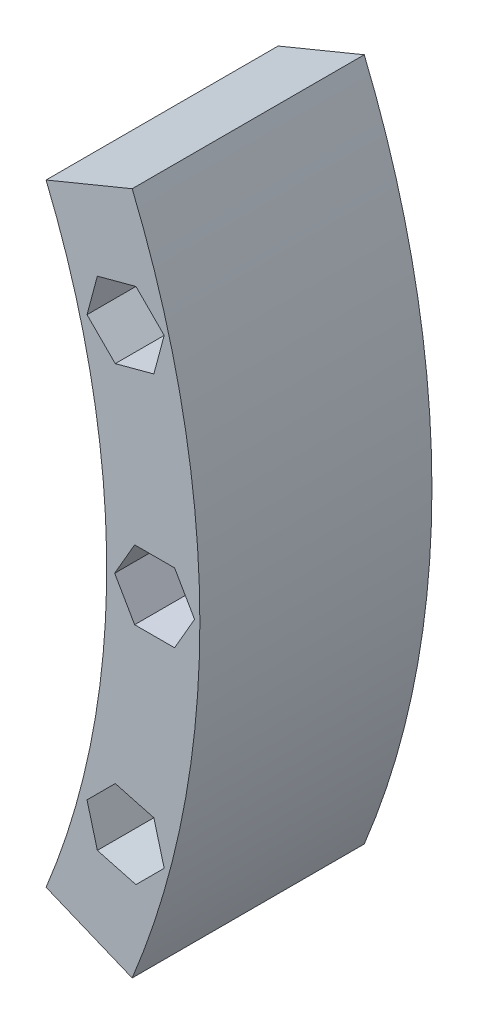
ISO-10303-21;
HEADER;
FILE_DESCRIPTION(('STEP AP214'),'2;1');
FILE_NAME('part.step','',(''),(''),'','','');
FILE_SCHEMA(('AUTOMOTIVE_DESIGN { 1 0 10303 214 1 1 1 1 }'));
ENDSEC;
DATA;
#1=APPLICATION_CONTEXT('core data for automotive mechanical design processes');
#2=APPLICATION_PROTOCOL_DEFINITION('international standard','automotive_design',2000,#1);
#3=PRODUCT_CONTEXT('',#1,'mechanical');
#4=PRODUCT('Part','Part','',(#3));
#5=PRODUCT_RELATED_PRODUCT_CATEGORY('part','',(#4));
#6=PRODUCT_DEFINITION_FORMATION('','',#4);
#7=PRODUCT_DEFINITION_CONTEXT('part definition',#1,'design');
#8=PRODUCT_DEFINITION('design','',#6,#7);
#9=PRODUCT_DEFINITION_SHAPE('','',#8);
#10=(LENGTH_UNIT() NAMED_UNIT(*) SI_UNIT(.MILLI.,.METRE.));
#11=(NAMED_UNIT(*) PLANE_ANGLE_UNIT() SI_UNIT($,.RADIAN.));
#12=(NAMED_UNIT(*) SI_UNIT($,.STERADIAN.) SOLID_ANGLE_UNIT());
#13=UNCERTAINTY_MEASURE_WITH_UNIT(LENGTH_MEASURE(1.E-05),#10,'distance_accuracy_value','');
#14=(GEOMETRIC_REPRESENTATION_CONTEXT(3) GLOBAL_UNCERTAINTY_ASSIGNED_CONTEXT((#13)) GLOBAL_UNIT_ASSIGNED_CONTEXT((#10,
#11,#12)) REPRESENTATION_CONTEXT('',''));
#15=CARTESIAN_POINT('',(0.,0.,0.));
#16=DIRECTION('',(0.,0.,1.));
#17=DIRECTION('',(1.,0.,0.));
#18=AXIS2_PLACEMENT_3D('',#15,#16,#17);
#19=CARTESIAN_POINT('',(0.,0.,21.81));
#20=DIRECTION('',(0.,0.,-1.));
#21=DIRECTION('',(-1.,0.,0.));
#22=AXIS2_PLACEMENT_3D('',#19,#20,#21);
#23=PLANE('',#22);
#24=DIRECTION('',(0.258819045102525,0.965925826289067,0.));
#25=VECTOR('',#24,1.);
#26=CARTESIAN_POINT('',(80.8989700859897,21.6768137030501,21.81));
#27=LINE('',#26,#25);
#28=CARTESIAN_POINT('',(79.9276799911408,18.0519097201859,21.81));
#29=VERTEX_POINT('',#28);
#30=CARTESIAN_POINT('',(80.8989700859897,21.6768137030501,21.81));
#31=VERTEX_POINT('',#30);
#32=EDGE_CURVE('E233',#29,#31,#27,.T.);
#33=ORIENTED_EDGE('',*,*,#32,.F.);
#34=DIRECTION('',(0.96592582628907,0.258819045102514,0.));
#35=VECTOR('',#34,1.);
#36=CARTESIAN_POINT('',(79.9276799911408,18.0519097201859,21.81));
#37=LINE('',#36,#35);
#38=CARTESIAN_POINT('',(76.3027760082773,17.0806196253373,21.81));
#39=VERTEX_POINT('',#38);
#40=EDGE_CURVE('E245',#39,#29,#37,.T.);
#41=ORIENTED_EDGE('',*,*,#40,.F.);
#42=DIRECTION('',(0.707106781186542,-0.707106781186553,0.));
#43=VECTOR('',#42,1.);
#44=CARTESIAN_POINT('',(76.3027760082773,17.0806196253373,21.81));
#45=LINE('',#44,#43);
#46=CARTESIAN_POINT('',(73.649162120262,19.7342335133527,21.81));
#47=VERTEX_POINT('',#46);
#48=EDGE_CURVE('E242',#47,#39,#45,.T.);
#49=ORIENTED_EDGE('',*,*,#48,.F.);
#50=DIRECTION('',(-0.258819045102526,-0.965925826289067,0.));
#51=VECTOR('',#50,1.);
#52=CARTESIAN_POINT('',(73.649162120262,19.7342335133527,21.81));
#53=LINE('',#52,#51);
#54=CARTESIAN_POINT('',(74.6204522151106,23.3591374962161,21.81));
#55=VERTEX_POINT('',#54);
#56=EDGE_CURVE('E240',#55,#47,#53,.T.);
#57=ORIENTED_EDGE('',*,*,#56,.F.);
#58=DIRECTION('',(-0.96592582628907,-0.258819045102513,0.));
#59=VECTOR('',#58,1.);
#60=CARTESIAN_POINT('',(74.6204522151106,23.3591374962161,21.81));
#61=LINE('',#60,#59);
#62=CARTESIAN_POINT('',(78.2453561979748,24.3304275910649,21.81));
#63=VERTEX_POINT('',#62);
#64=EDGE_CURVE('E238',#63,#55,#61,.T.);
#65=ORIENTED_EDGE('',*,*,#64,.F.);
#66=DIRECTION('',(-0.707106781186541,0.707106781186554,0.));
#67=VECTOR('',#66,1.);
#68=CARTESIAN_POINT('',(78.2453561979748,24.3304275910649,21.81));
#69=LINE('',#68,#67);
#70=EDGE_CURVE('E235',#31,#63,#69,.T.);
#71=ORIENTED_EDGE('',*,*,#70,.F.);
#72=EDGE_LOOP('',(#33,#41,#49,#57,#65,#71));
#73=FACE_BOUND('',#72,.T.);
#74=DIRECTION('',(-0.924546033612337,-0.381070376350217,0.));
#75=VECTOR('',#74,1.);
#76=CARTESIAN_POINT('',(77.1995938066281,31.8193764252479,21.81));
#77=LINE('',#76,#75);
#78=CARTESIAN_POINT('',(77.8930033318373,32.1051792075106,21.81));
#79=VERTEX_POINT('',#78);
#80=CARTESIAN_POINT('',(69.8032255377296,28.7708134144457,21.81));
#81=VERTEX_POINT('',#80);
#82=EDGE_CURVE('E323',#79,#81,#77,.T.);
#83=ORIENTED_EDGE('',*,*,#82,.T.);
#84=CARTESIAN_POINT('',(0.,0.,21.81));
#85=DIRECTION('',(0.,0.,-1.));
#86=DIRECTION('',(-1.,0.,0.));
#87=AXIS2_PLACEMENT_3D('',#84,#85,#86);
#88=CIRCLE('',#87,75.5);
#89=CARTESIAN_POINT('',(69.8032255377296,-28.7708134144457,21.81));
#90=VERTEX_POINT('',#89);
#91=EDGE_CURVE('E325',#81,#90,#88,.T.);
#92=ORIENTED_EDGE('',*,*,#91,.T.);
#93=DIRECTION('',(0.924546033612313,-0.381070376350275,0.));
#94=VECTOR('',#93,1.);
#95=CARTESIAN_POINT('',(77.1995938066281,-31.8193764252479,21.81));
#96=LINE('',#95,#94);
#97=CARTESIAN_POINT('',(77.8930033318373,-32.1051792075106,21.81));
#98=VERTEX_POINT('',#97);
#99=EDGE_CURVE('E328',#90,#98,#96,.T.);
#100=ORIENTED_EDGE('',*,*,#99,.T.);
#101=CARTESIAN_POINT('',(0.,0.,21.81));
#102=DIRECTION('',(0.,0.,1.));
#103=DIRECTION('',(-1.,0.,0.));
#104=AXIS2_PLACEMENT_3D('',#101,#102,#103);
#105=CIRCLE('',#104,84.2499999999999);
#106=EDGE_CURVE('E330',#98,#79,#105,.T.);
#107=ORIENTED_EDGE('',*,*,#106,.T.);
#108=EDGE_LOOP('',(#83,#92,#100,#107));
#109=FACE_BOUND('',#108,.T.);
#110=DIRECTION('',(-0.5,-0.866025403784438,0.));
#111=VECTOR('',#110,1.);
#112=CARTESIAN_POINT('',(78.1236116251337,3.25000000000181,21.81));
#113=LINE('',#112,#111);
#114=CARTESIAN_POINT('',(78.1236116251337,3.25000000000181,21.81));
#115=VERTEX_POINT('',#114);
#116=CARTESIAN_POINT('',(76.2472232502674,1.81723126130295E-12,21.81));
#117=VERTEX_POINT('',#116);
#118=EDGE_CURVE('E278',#115,#117,#113,.T.);
#119=ORIENTED_EDGE('',*,*,#118,.F.);
#120=DIRECTION('',(-1.,0.,0.));
#121=VECTOR('',#120,1.);
#122=CARTESIAN_POINT('',(81.8763883748663,3.25000000000181,21.81));
#123=LINE('',#122,#121);
#124=CARTESIAN_POINT('',(81.8763883748663,3.25000000000181,21.81));
#125=VERTEX_POINT('',#124);
#126=EDGE_CURVE('E290',#125,#115,#123,.T.);
#127=ORIENTED_EDGE('',*,*,#126,.F.);
#128=DIRECTION('',(-0.5,0.866025403784439,0.));
#129=VECTOR('',#128,1.);
#130=CARTESIAN_POINT('',(83.7527767497325,1.81164762011465E-12,21.81));
#131=LINE('',#130,#129);
#132=CARTESIAN_POINT('',(83.7527767497325,1.81164762011465E-12,21.81));
#133=VERTEX_POINT('',#132);
#134=EDGE_CURVE('E287',#133,#125,#131,.T.);
#135=ORIENTED_EDGE('',*,*,#134,.F.);
#136=DIRECTION('',(0.5,0.866025403784439,0.));
#137=VECTOR('',#136,1.);
#138=CARTESIAN_POINT('',(81.8763883748663,-3.24999999999819,21.81));
#139=LINE('',#138,#137);
#140=CARTESIAN_POINT('',(81.8763883748663,-3.24999999999819,21.81));
#141=VERTEX_POINT('',#140);
#142=EDGE_CURVE('E285',#141,#133,#139,.T.);
#143=ORIENTED_EDGE('',*,*,#142,.F.);
#144=DIRECTION('',(1.,0.,0.));
#145=VECTOR('',#144,1.);
#146=CARTESIAN_POINT('',(78.1236116251337,-3.24999999999819,21.81));
#147=LINE('',#146,#145);
#148=CARTESIAN_POINT('',(78.1236116251337,-3.24999999999819,21.81));
#149=VERTEX_POINT('',#148);
#150=EDGE_CURVE('E283',#149,#141,#147,.T.);
#151=ORIENTED_EDGE('',*,*,#150,.F.);
#152=DIRECTION('',(0.5,-0.866025403784439,0.));
#153=VECTOR('',#152,1.);
#154=CARTESIAN_POINT('',(76.2472232502674,1.81723126130295E-12,21.81));
#155=LINE('',#154,#153);
#156=EDGE_CURVE('E280',#117,#149,#155,.T.);
#157=ORIENTED_EDGE('',*,*,#156,.F.);
#158=EDGE_LOOP('',(#119,#127,#135,#143,#151,#157));
#159=FACE_BOUND('',#158,.T.);
#160=DIRECTION('',(0.258819045102525,-0.965925826289067,0.));
#161=VECTOR('',#160,1.);
#162=CARTESIAN_POINT('',(73.649162120262,-19.7342335133526,21.81));
#163=LINE('',#162,#161);
#164=CARTESIAN_POINT('',(73.649162120262,-19.7342335133526,21.81));
#165=VERTEX_POINT('',#164);
#166=CARTESIAN_POINT('',(74.6204522151107,-23.3591374962161,21.81));
#167=VERTEX_POINT('',#166);
#168=EDGE_CURVE('E182',#165,#167,#163,.T.);
#169=ORIENTED_EDGE('',*,*,#168,.F.);
#170=DIRECTION('',(-0.707106781186542,-0.707106781186553,0.));
#171=VECTOR('',#170,1.);
#172=CARTESIAN_POINT('',(76.3027760082767,-17.0806196253379,21.81));
#173=LINE('',#172,#171);
#174=CARTESIAN_POINT('',(76.3027760082767,-17.0806196253379,21.81));
#175=VERTEX_POINT('',#174);
#176=EDGE_CURVE('E211',#175,#165,#173,.T.);
#177=ORIENTED_EDGE('',*,*,#176,.F.);
#178=DIRECTION('',(-0.96592582628907,0.258819045102514,0.));
#179=VECTOR('',#178,1.);
#180=CARTESIAN_POINT('',(79.9276799911411,-18.0519097201868,21.81));
#181=LINE('',#180,#179);
#182=CARTESIAN_POINT('',(79.9276799911411,-18.0519097201868,21.81));
#183=VERTEX_POINT('',#182);
#184=EDGE_CURVE('E209',#183,#175,#181,.T.);
#185=ORIENTED_EDGE('',*,*,#184,.F.);
#186=DIRECTION('',(-0.258819045102528,0.965925826289066,0.));
#187=VECTOR('',#186,1.);
#188=CARTESIAN_POINT('',(80.8989700859897,-21.67681370305,21.81));
#189=LINE('',#188,#187);
#190=CARTESIAN_POINT('',(80.8989700859897,-21.67681370305,21.81));
#191=VERTEX_POINT('',#190);
#192=EDGE_CURVE('E205',#191,#183,#189,.T.);
#193=ORIENTED_EDGE('',*,*,#192,.F.);
#194=DIRECTION('',(0.707106781186545,0.70710678118655,0.));
#195=VECTOR('',#194,1.);
#196=CARTESIAN_POINT('',(78.2453561979748,-24.3304275910649,21.81));
#197=LINE('',#196,#195);
#198=CARTESIAN_POINT('',(78.2453561979748,-24.3304275910649,21.81));
#199=VERTEX_POINT('',#198);
#200=EDGE_CURVE('E203',#199,#191,#197,.T.);
#201=ORIENTED_EDGE('',*,*,#200,.F.);
#202=DIRECTION('',(0.96592582628907,-0.258819045102513,0.));
#203=VECTOR('',#202,1.);
#204=CARTESIAN_POINT('',(74.6204522151107,-23.3591374962161,21.81));
#205=LINE('',#204,#203);
#206=EDGE_CURVE('E190',#167,#199,#205,.T.);
#207=ORIENTED_EDGE('',*,*,#206,.F.);
#208=EDGE_LOOP('',(#169,#177,#185,#193,#201,#207));
#209=FACE_BOUND('',#208,.T.);
#210=ADVANCED_FACE('F33',(#73,#109,#159,#209),#23,.F.);
#211=CARTESIAN_POINT('',(0.,0.,0.01));
#212=DIRECTION('',(0.,0.,-1.));
#213=DIRECTION('',(-1.,0.,0.));
#214=AXIS2_PLACEMENT_3D('',#211,#212,#213);
#215=PLANE('',#214);
#216=DIRECTION('',(-0.924546033612311,-0.38107037635028,0.));
#217=VECTOR('',#216,1.);
#218=CARTESIAN_POINT('',(77.1995938066281,31.8193764252479,0.01));
#219=LINE('',#218,#217);
#220=CARTESIAN_POINT('',(77.8930033318373,32.1051792075106,0.01));
#221=VERTEX_POINT('',#220);
#222=CARTESIAN_POINT('',(69.8032255377296,28.7708134144457,0.01));
#223=VERTEX_POINT('',#222);
#224=EDGE_CURVE('E322',#221,#223,#219,.T.);
#225=ORIENTED_EDGE('',*,*,#224,.F.);
#226=CARTESIAN_POINT('',(0.,0.,0.01));
#227=DIRECTION('',(0.,0.,1.));
#228=DIRECTION('',(-1.,0.,0.));
#229=AXIS2_PLACEMENT_3D('',#226,#227,#228);
#230=CIRCLE('',#229,84.2499999999999);
#231=CARTESIAN_POINT('',(77.8930033318373,-32.1051792075106,0.01));
#232=VERTEX_POINT('',#231);
#233=EDGE_CURVE('E326',#232,#221,#230,.T.);
#234=ORIENTED_EDGE('',*,*,#233,.F.);
#235=DIRECTION('',(0.924546033612314,-0.381070376350271,0.));
#236=VECTOR('',#235,1.);
#237=CARTESIAN_POINT('',(77.1995938066281,-31.8193764252479,0.01));
#238=LINE('',#237,#236);
#239=CARTESIAN_POINT('',(69.8032255377296,-28.7708134144457,0.01));
#240=VERTEX_POINT('',#239);
#241=EDGE_CURVE('E337',#240,#232,#238,.T.);
#242=ORIENTED_EDGE('',*,*,#241,.F.);
#243=CARTESIAN_POINT('',(0.,0.,0.01));
#244=DIRECTION('',(0.,0.,-1.));
#245=DIRECTION('',(-1.,0.,0.));
#246=AXIS2_PLACEMENT_3D('',#243,#244,#245);
#247=CIRCLE('',#246,75.5);
#248=EDGE_CURVE('E334',#223,#240,#247,.T.);
#249=ORIENTED_EDGE('',*,*,#248,.F.);
#250=EDGE_LOOP('',(#225,#234,#242,#249));
#251=FACE_BOUND('',#250,.T.);
#252=DIRECTION('',(-1.,0.,0.));
#253=VECTOR('',#252,1.);
#254=CARTESIAN_POINT('',(81.8763883748663,3.25000000000181,0.01));
#255=LINE('',#254,#253);
#256=CARTESIAN_POINT('',(81.8763883748663,3.25000000000181,0.01));
#257=VERTEX_POINT('',#256);
#258=CARTESIAN_POINT('',(78.1236116251337,3.25000000000181,0.01));
#259=VERTEX_POINT('',#258);
#260=EDGE_CURVE('E281',#257,#259,#255,.T.);
#261=ORIENTED_EDGE('',*,*,#260,.T.);
#262=DIRECTION('',(-0.5,-0.866025403784438,0.));
#263=VECTOR('',#262,1.);
#264=CARTESIAN_POINT('',(78.1236116251337,3.25000000000181,0.01));
#265=LINE('',#264,#263);
#266=CARTESIAN_POINT('',(76.2472232502674,1.81723126130295E-12,0.01));
#267=VERTEX_POINT('',#266);
#268=EDGE_CURVE('E277',#259,#267,#265,.T.);
#269=ORIENTED_EDGE('',*,*,#268,.T.);
#270=DIRECTION('',(0.5,-0.866025403784439,0.));
#271=VECTOR('',#270,1.);
#272=CARTESIAN_POINT('',(76.2472232502674,1.81723126130295E-12,0.01));
#273=LINE('',#272,#271);
#274=CARTESIAN_POINT('',(78.1236116251337,-3.24999999999819,0.01));
#275=VERTEX_POINT('',#274);
#276=EDGE_CURVE('E295',#267,#275,#273,.T.);
#277=ORIENTED_EDGE('',*,*,#276,.T.);
#278=DIRECTION('',(1.,0.,0.));
#279=VECTOR('',#278,1.);
#280=CARTESIAN_POINT('',(78.1236116251337,-3.24999999999819,0.01));
#281=LINE('',#280,#279);
#282=CARTESIAN_POINT('',(81.8763883748663,-3.24999999999819,0.01));
#283=VERTEX_POINT('',#282);
#284=EDGE_CURVE('E298',#275,#283,#281,.T.);
#285=ORIENTED_EDGE('',*,*,#284,.T.);
#286=DIRECTION('',(0.5,0.866025403784439,0.));
#287=VECTOR('',#286,1.);
#288=CARTESIAN_POINT('',(81.8763883748663,-3.24999999999819,0.01));
#289=LINE('',#288,#287);
#290=CARTESIAN_POINT('',(83.7527767497325,1.81164762011465E-12,0.01));
#291=VERTEX_POINT('',#290);
#292=EDGE_CURVE('E301',#283,#291,#289,.T.);
#293=ORIENTED_EDGE('',*,*,#292,.T.);
#294=DIRECTION('',(-0.5,0.866025403784439,0.));
#295=VECTOR('',#294,1.);
#296=CARTESIAN_POINT('',(83.7527767497325,1.81164762011465E-12,0.01));
#297=LINE('',#296,#295);
#298=EDGE_CURVE('E304',#291,#257,#297,.T.);
#299=ORIENTED_EDGE('',*,*,#298,.T.);
#300=EDGE_LOOP('',(#261,#269,#277,#285,#293,#299));
#301=FACE_BOUND('',#300,.T.);
#302=DIRECTION('',(0.96592582628907,0.258819045102514,0.));
#303=VECTOR('',#302,1.);
#304=CARTESIAN_POINT('',(79.9276799911408,18.0519097201859,0.01));
#305=LINE('',#304,#303);
#306=CARTESIAN_POINT('',(76.3027760082773,17.0806196253373,0.01));
#307=VERTEX_POINT('',#306);
#308=CARTESIAN_POINT('',(79.9276799911408,18.0519097201859,0.01));
#309=VERTEX_POINT('',#308);
#310=EDGE_CURVE('E236',#307,#309,#305,.T.);
#311=ORIENTED_EDGE('',*,*,#310,.T.);
#312=DIRECTION('',(0.258819045102525,0.965925826289067,0.));
#313=VECTOR('',#312,1.);
#314=CARTESIAN_POINT('',(80.8989700859897,21.6768137030501,0.01));
#315=LINE('',#314,#313);
#316=CARTESIAN_POINT('',(80.8989700859897,21.6768137030501,0.01));
#317=VERTEX_POINT('',#316);
#318=EDGE_CURVE('E198',#309,#317,#315,.T.);
#319=ORIENTED_EDGE('',*,*,#318,.T.);
#320=DIRECTION('',(-0.707106781186541,0.707106781186554,0.));
#321=VECTOR('',#320,1.);
#322=CARTESIAN_POINT('',(78.2453561979748,24.3304275910649,0.01));
#323=LINE('',#322,#321);
#324=CARTESIAN_POINT('',(78.2453561979748,24.3304275910649,0.01));
#325=VERTEX_POINT('',#324);
#326=EDGE_CURVE('E250',#317,#325,#323,.T.);
#327=ORIENTED_EDGE('',*,*,#326,.T.);
#328=DIRECTION('',(-0.96592582628907,-0.258819045102513,0.));
#329=VECTOR('',#328,1.);
#330=CARTESIAN_POINT('',(74.6204522151106,23.3591374962161,0.01));
#331=LINE('',#330,#329);
#332=CARTESIAN_POINT('',(74.6204522151106,23.3591374962161,0.01));
#333=VERTEX_POINT('',#332);
#334=EDGE_CURVE('E253',#325,#333,#331,.T.);
#335=ORIENTED_EDGE('',*,*,#334,.T.);
#336=DIRECTION('',(-0.258819045102526,-0.965925826289067,0.));
#337=VECTOR('',#336,1.);
#338=CARTESIAN_POINT('',(73.649162120262,19.7342335133527,0.01));
#339=LINE('',#338,#337);
#340=CARTESIAN_POINT('',(73.649162120262,19.7342335133527,0.01));
#341=VERTEX_POINT('',#340);
#342=EDGE_CURVE('E256',#333,#341,#339,.T.);
#343=ORIENTED_EDGE('',*,*,#342,.T.);
#344=DIRECTION('',(0.707106781186542,-0.707106781186553,0.));
#345=VECTOR('',#344,1.);
#346=CARTESIAN_POINT('',(76.3027760082773,17.0806196253373,0.01));
#347=LINE('',#346,#345);
#348=EDGE_CURVE('E259',#341,#307,#347,.T.);
#349=ORIENTED_EDGE('',*,*,#348,.T.);
#350=EDGE_LOOP('',(#311,#319,#327,#335,#343,#349));
#351=FACE_BOUND('',#350,.T.);
#352=DIRECTION('',(-0.707106781186542,-0.707106781186553,0.));
#353=VECTOR('',#352,1.);
#354=CARTESIAN_POINT('',(76.3027760082767,-17.0806196253379,0.01));
#355=LINE('',#354,#353);
#356=CARTESIAN_POINT('',(76.3027760082767,-17.0806196253379,0.01));
#357=VERTEX_POINT('',#356);
#358=CARTESIAN_POINT('',(73.649162120262,-19.7342335133526,0.01));
#359=VERTEX_POINT('',#358);
#360=EDGE_CURVE('E191',#357,#359,#355,.T.);
#361=ORIENTED_EDGE('',*,*,#360,.T.);
#362=DIRECTION('',(0.258819045102525,-0.965925826289067,0.));
#363=VECTOR('',#362,1.);
#364=CARTESIAN_POINT('',(73.649162120262,-19.7342335133526,0.01));
#365=LINE('',#364,#363);
#366=CARTESIAN_POINT('',(74.6204522151107,-23.3591374962161,0.01));
#367=VERTEX_POINT('',#366);
#368=EDGE_CURVE('E56',#359,#367,#365,.T.);
#369=ORIENTED_EDGE('',*,*,#368,.T.);
#370=DIRECTION('',(0.96592582628907,-0.258819045102513,0.));
#371=VECTOR('',#370,1.);
#372=CARTESIAN_POINT('',(74.6204522151107,-23.3591374962161,0.01));
#373=LINE('',#372,#371);
#374=CARTESIAN_POINT('',(78.2453561979748,-24.3304275910649,0.01));
#375=VERTEX_POINT('',#374);
#376=EDGE_CURVE('E197',#367,#375,#373,.T.);
#377=ORIENTED_EDGE('',*,*,#376,.T.);
#378=DIRECTION('',(0.707106781186545,0.70710678118655,0.));
#379=VECTOR('',#378,1.);
#380=CARTESIAN_POINT('',(78.2453561979748,-24.3304275910649,0.01));
#381=LINE('',#380,#379);
#382=CARTESIAN_POINT('',(80.8989700859897,-21.67681370305,0.01));
#383=VERTEX_POINT('',#382);
#384=EDGE_CURVE('E215',#375,#383,#381,.T.);
#385=ORIENTED_EDGE('',*,*,#384,.T.);
#386=DIRECTION('',(-0.258819045102528,0.965925826289066,0.));
#387=VECTOR('',#386,1.);
#388=CARTESIAN_POINT('',(80.8989700859897,-21.67681370305,0.01));
#389=LINE('',#388,#387);
#390=CARTESIAN_POINT('',(79.9276799911411,-18.0519097201868,0.01));
#391=VERTEX_POINT('',#390);
#392=EDGE_CURVE('E218',#383,#391,#389,.T.);
#393=ORIENTED_EDGE('',*,*,#392,.T.);
#394=DIRECTION('',(-0.96592582628907,0.258819045102514,0.));
#395=VECTOR('',#394,1.);
#396=CARTESIAN_POINT('',(79.9276799911411,-18.0519097201868,0.01));
#397=LINE('',#396,#395);
#398=EDGE_CURVE('E221',#391,#357,#397,.T.);
#399=ORIENTED_EDGE('',*,*,#398,.T.);
#400=EDGE_LOOP('',(#361,#369,#377,#385,#393,#399));
#401=FACE_BOUND('',#400,.T.);
#402=ADVANCED_FACE('F357',(#251,#301,#351,#401),#215,.T.);
#403=CARTESIAN_POINT('',(77.1995938066281,31.8193764252479,21.81));
#404=DIRECTION('',(0.38107037635028,-0.924546033612311,0.));
#405=DIRECTION('',(0.924546033612311,0.38107037635028,0.));
#406=AXIS2_PLACEMENT_3D('',#403,#404,#405);
#407=PLANE('',#406);
#408=ORIENTED_EDGE('',*,*,#224,.T.);
#409=DIRECTION('',(0.,0.,-1.));
#410=VECTOR('',#409,1.);
#411=CARTESIAN_POINT('',(69.8032255377296,28.7708134144457,21.81));
#412=LINE('',#411,#410);
#413=EDGE_CURVE('E11',#81,#223,#412,.T.);
#414=ORIENTED_EDGE('',*,*,#413,.F.);
#415=ORIENTED_EDGE('',*,*,#82,.F.);
#416=DIRECTION('',(0.,0.,-1.));
#417=VECTOR('',#416,1.);
#418=CARTESIAN_POINT('',(77.8930033318373,32.1051792075106,21.81));
#419=LINE('',#418,#417);
#420=EDGE_CURVE('E332',#79,#221,#419,.T.);
#421=ORIENTED_EDGE('',*,*,#420,.T.);
#422=EDGE_LOOP('',(#408,#414,#415,#421));
#423=FACE_BOUND('',#422,.T.);
#424=ADVANCED_FACE('F35',(#423),#407,.F.);
#425=CARTESIAN_POINT('',(0.,0.,21.81));
#426=DIRECTION('',(0.,0.,-1.));
#427=DIRECTION('',(-1.,0.,0.));
#428=AXIS2_PLACEMENT_3D('',#425,#426,#427);
#429=CYLINDRICAL_SURFACE('',#428,75.5);
#430=ORIENTED_EDGE('',*,*,#248,.T.);
#431=DIRECTION('',(0.,0.,-1.));
#432=VECTOR('',#431,1.);
#433=CARTESIAN_POINT('',(69.8032255377296,-28.7708134144457,21.81));
#434=LINE('',#433,#432);
#435=EDGE_CURVE('E41',#90,#240,#434,.T.);
#436=ORIENTED_EDGE('',*,*,#435,.F.);
#437=ORIENTED_EDGE('',*,*,#91,.F.);
#438=ORIENTED_EDGE('',*,*,#413,.T.);
#439=EDGE_LOOP('',(#430,#436,#437,#438));
#440=FACE_BOUND('',#439,.T.);
#441=ADVANCED_FACE('F353',(#440),#429,.F.);
#442=CARTESIAN_POINT('',(77.1995938066281,-31.8193764252479,21.81));
#443=DIRECTION('',(0.381070376350271,0.924546033612314,0.));
#444=DIRECTION('',(-0.924546033612314,0.381070376350271,0.));
#445=AXIS2_PLACEMENT_3D('',#442,#443,#444);
#446=PLANE('',#445);
#447=ORIENTED_EDGE('',*,*,#241,.T.);
#448=DIRECTION('',(0.,0.,-1.));
#449=VECTOR('',#448,1.);
#450=CARTESIAN_POINT('',(77.8930033318373,-32.1051792075106,21.81));
#451=LINE('',#450,#449);
#452=EDGE_CURVE('E343',#98,#232,#451,.T.);
#453=ORIENTED_EDGE('',*,*,#452,.F.);
#454=ORIENTED_EDGE('',*,*,#99,.F.);
#455=ORIENTED_EDGE('',*,*,#435,.T.);
#456=EDGE_LOOP('',(#447,#453,#454,#455));
#457=FACE_BOUND('',#456,.T.);
#458=ADVANCED_FACE('F349',(#457),#446,.F.);
#459=CARTESIAN_POINT('',(0.,0.,21.81));
#460=DIRECTION('',(0.,0.,-1.));
#461=DIRECTION('',(-1.,0.,0.));
#462=AXIS2_PLACEMENT_3D('',#459,#460,#461);
#463=CYLINDRICAL_SURFACE('',#462,84.2499999999999);
#464=ORIENTED_EDGE('',*,*,#233,.T.);
#465=ORIENTED_EDGE('',*,*,#420,.F.);
#466=ORIENTED_EDGE('',*,*,#106,.F.);
#467=ORIENTED_EDGE('',*,*,#452,.T.);
#468=EDGE_LOOP('',(#464,#465,#466,#467));
#469=FACE_BOUND('',#468,.T.);
#470=ADVANCED_FACE('F362',(#469),#463,.T.);
#471=CARTESIAN_POINT('',(78.1236116251337,3.25000000000181,21.81));
#472=DIRECTION('',(0.866025403784438,-0.5,0.));
#473=DIRECTION('',(0.5,0.866025403784438,0.));
#474=AXIS2_PLACEMENT_3D('',#471,#472,#473);
#475=PLANE('',#474);
#476=ORIENTED_EDGE('',*,*,#268,.F.);
#477=DIRECTION('',(0.,0.,-1.));
#478=VECTOR('',#477,1.);
#479=CARTESIAN_POINT('',(78.1236116251337,3.25000000000181,21.81));
#480=LINE('',#479,#478);
#481=EDGE_CURVE('E292',#115,#259,#480,.T.);
#482=ORIENTED_EDGE('',*,*,#481,.F.);
#483=ORIENTED_EDGE('',*,*,#118,.T.);
#484=DIRECTION('',(0.,0.,-1.));
#485=VECTOR('',#484,1.);
#486=CARTESIAN_POINT('',(76.2472232502674,1.81723126130295E-12,21.81));
#487=LINE('',#486,#485);
#488=EDGE_CURVE('E319',#117,#267,#487,.T.);
#489=ORIENTED_EDGE('',*,*,#488,.T.);
#490=EDGE_LOOP('',(#476,#482,#483,#489));
#491=FACE_BOUND('',#490,.T.);
#492=ADVANCED_FACE('F379',(#491),#475,.T.);
#493=CARTESIAN_POINT('',(76.2472232502674,1.81723126130295E-12,21.81));
#494=DIRECTION('',(0.866025403784439,0.5,0.));
#495=DIRECTION('',(-0.5,0.866025403784439,0.));
#496=AXIS2_PLACEMENT_3D('',#493,#494,#495);
#497=PLANE('',#496);
#498=ORIENTED_EDGE('',*,*,#276,.F.);
#499=ORIENTED_EDGE('',*,*,#488,.F.);
#500=ORIENTED_EDGE('',*,*,#156,.T.);
#501=DIRECTION('',(0.,0.,-1.));
#502=VECTOR('',#501,1.);
#503=CARTESIAN_POINT('',(78.1236116251337,-3.24999999999819,21.81));
#504=LINE('',#503,#502);
#505=EDGE_CURVE('E317',#149,#275,#504,.T.);
#506=ORIENTED_EDGE('',*,*,#505,.T.);
#507=EDGE_LOOP('',(#498,#499,#500,#506));
#508=FACE_BOUND('',#507,.T.);
#509=ADVANCED_FACE('F381',(#508),#497,.T.);
#510=CARTESIAN_POINT('',(78.1236116251337,-3.24999999999819,21.81));
#511=DIRECTION('',(0.,1.,0.));
#512=DIRECTION('',(0.,0.,1.));
#513=AXIS2_PLACEMENT_3D('',#510,#511,#512);
#514=PLANE('',#513);
#515=ORIENTED_EDGE('',*,*,#284,.F.);
#516=ORIENTED_EDGE('',*,*,#505,.F.);
#517=ORIENTED_EDGE('',*,*,#150,.T.);
#518=DIRECTION('',(0.,0.,-1.));
#519=VECTOR('',#518,1.);
#520=CARTESIAN_POINT('',(81.8763883748663,-3.24999999999819,21.81));
#521=LINE('',#520,#519);
#522=EDGE_CURVE('E315',#141,#283,#521,.T.);
#523=ORIENTED_EDGE('',*,*,#522,.T.);
#524=EDGE_LOOP('',(#515,#516,#517,#523));
#525=FACE_BOUND('',#524,.T.);
#526=ADVANCED_FACE('F398',(#525),#514,.T.);
#527=CARTESIAN_POINT('',(81.8763883748663,-3.24999999999819,21.81));
#528=DIRECTION('',(-0.866025403784438,0.5,0.));
#529=DIRECTION('',(-0.5,-0.866025403784439,0.));
#530=AXIS2_PLACEMENT_3D('',#527,#528,#529);
#531=PLANE('',#530);
#532=ORIENTED_EDGE('',*,*,#292,.F.);
#533=ORIENTED_EDGE('',*,*,#522,.F.);
#534=ORIENTED_EDGE('',*,*,#142,.T.);
#535=DIRECTION('',(0.,0.,-1.));
#536=VECTOR('',#535,1.);
#537=CARTESIAN_POINT('',(83.7527767497325,1.81164762011465E-12,21.81));
#538=LINE('',#537,#536);
#539=EDGE_CURVE('E313',#133,#291,#538,.T.);
#540=ORIENTED_EDGE('',*,*,#539,.T.);
#541=EDGE_LOOP('',(#532,#533,#534,#540));
#542=FACE_BOUND('',#541,.T.);
#543=ADVANCED_FACE('F396',(#542),#531,.T.);
#544=CARTESIAN_POINT('',(83.7527767497325,1.81164762011465E-12,21.81));
#545=DIRECTION('',(-0.866025403784439,-0.5,0.));
#546=DIRECTION('',(0.5,-0.866025403784439,0.));
#547=AXIS2_PLACEMENT_3D('',#544,#545,#546);
#548=PLANE('',#547);
#549=ORIENTED_EDGE('',*,*,#298,.F.);
#550=ORIENTED_EDGE('',*,*,#539,.F.);
#551=ORIENTED_EDGE('',*,*,#134,.T.);
#552=DIRECTION('',(0.,0.,-1.));
#553=VECTOR('',#552,1.);
#554=CARTESIAN_POINT('',(81.8763883748663,3.25000000000181,21.81));
#555=LINE('',#554,#553);
#556=EDGE_CURVE('E311',#125,#257,#555,.T.);
#557=ORIENTED_EDGE('',*,*,#556,.T.);
#558=EDGE_LOOP('',(#549,#550,#551,#557));
#559=FACE_BOUND('',#558,.T.);
#560=ADVANCED_FACE('F391',(#559),#548,.T.);
#561=CARTESIAN_POINT('',(81.8763883748663,3.25000000000181,21.81));
#562=DIRECTION('',(0.,-1.,0.));
#563=DIRECTION('',(0.,0.,-1.));
#564=AXIS2_PLACEMENT_3D('',#561,#562,#563);
#565=PLANE('',#564);
#566=ORIENTED_EDGE('',*,*,#260,.F.);
#567=ORIENTED_EDGE('',*,*,#556,.F.);
#568=ORIENTED_EDGE('',*,*,#126,.T.);
#569=ORIENTED_EDGE('',*,*,#481,.T.);
#570=EDGE_LOOP('',(#566,#567,#568,#569));
#571=FACE_BOUND('',#570,.T.);
#572=ADVANCED_FACE('F387',(#571),#565,.T.);
#573=CARTESIAN_POINT('',(80.8989700859897,21.6768137030501,21.81));
#574=DIRECTION('',(-0.965925826289067,0.258819045102525,0.));
#575=DIRECTION('',(-0.258819045102525,-0.965925826289067,0.));
#576=AXIS2_PLACEMENT_3D('',#573,#574,#575);
#577=PLANE('',#576);
#578=ORIENTED_EDGE('',*,*,#318,.F.);
#579=DIRECTION('',(0.,0.,-1.));
#580=VECTOR('',#579,1.);
#581=CARTESIAN_POINT('',(79.9276799911408,18.0519097201859,21.81));
#582=LINE('',#581,#580);
#583=EDGE_CURVE('E247',#29,#309,#582,.T.);
#584=ORIENTED_EDGE('',*,*,#583,.F.);
#585=ORIENTED_EDGE('',*,*,#32,.T.);
#586=DIRECTION('',(0.,0.,-1.));
#587=VECTOR('',#586,1.);
#588=CARTESIAN_POINT('',(80.8989700859897,21.6768137030501,21.81));
#589=LINE('',#588,#587);
#590=EDGE_CURVE('E274',#31,#317,#589,.T.);
#591=ORIENTED_EDGE('',*,*,#590,.T.);
#592=EDGE_LOOP('',(#578,#584,#585,#591));
#593=FACE_BOUND('',#592,.T.);
#594=ADVANCED_FACE('F489',(#593),#577,.T.);
#595=CARTESIAN_POINT('',(78.2453561979748,24.3304275910649,21.81));
#596=DIRECTION('',(-0.707106781186554,-0.707106781186541,0.));
#597=DIRECTION('',(0.707106781186541,-0.707106781186554,0.));
#598=AXIS2_PLACEMENT_3D('',#595,#596,#597);
#599=PLANE('',#598);
#600=ORIENTED_EDGE('',*,*,#326,.F.);
#601=ORIENTED_EDGE('',*,*,#590,.F.);
#602=ORIENTED_EDGE('',*,*,#70,.T.);
#603=DIRECTION('',(0.,0.,-1.));
#604=VECTOR('',#603,1.);
#605=CARTESIAN_POINT('',(78.2453561979748,24.3304275910649,21.81));
#606=LINE('',#605,#604);
#607=EDGE_CURVE('E272',#63,#325,#606,.T.);
#608=ORIENTED_EDGE('',*,*,#607,.T.);
#609=EDGE_LOOP('',(#600,#601,#602,#608));
#610=FACE_BOUND('',#609,.T.);
#611=ADVANCED_FACE('F497',(#610),#599,.T.);
#612=CARTESIAN_POINT('',(74.6204522151106,23.3591374962161,21.81));
#613=DIRECTION('',(0.258819045102513,-0.96592582628907,0.));
#614=DIRECTION('',(0.965925826289071,0.258819045102513,0.));
#615=AXIS2_PLACEMENT_3D('',#612,#613,#614);
#616=PLANE('',#615);
#617=ORIENTED_EDGE('',*,*,#334,.F.);
#618=ORIENTED_EDGE('',*,*,#607,.F.);
#619=ORIENTED_EDGE('',*,*,#64,.T.);
#620=DIRECTION('',(0.,0.,-1.));
#621=VECTOR('',#620,1.);
#622=CARTESIAN_POINT('',(74.6204522151106,23.3591374962161,21.81));
#623=LINE('',#622,#621);
#624=EDGE_CURVE('E270',#55,#333,#623,.T.);
#625=ORIENTED_EDGE('',*,*,#624,.T.);
#626=EDGE_LOOP('',(#617,#618,#619,#625));
#627=FACE_BOUND('',#626,.T.);
#628=ADVANCED_FACE('F506',(#627),#616,.T.);
#629=CARTESIAN_POINT('',(73.649162120262,19.7342335133527,21.81));
#630=DIRECTION('',(0.965925826289067,-0.258819045102526,0.));
#631=DIRECTION('',(0.258819045102526,0.965925826289067,0.));
#632=AXIS2_PLACEMENT_3D('',#629,#630,#631);
#633=PLANE('',#632);
#634=ORIENTED_EDGE('',*,*,#342,.F.);
#635=ORIENTED_EDGE('',*,*,#624,.F.);
#636=ORIENTED_EDGE('',*,*,#56,.T.);
#637=DIRECTION('',(0.,0.,-1.));
#638=VECTOR('',#637,1.);
#639=CARTESIAN_POINT('',(73.649162120262,19.7342335133527,21.81));
#640=LINE('',#639,#638);
#641=EDGE_CURVE('E268',#47,#341,#640,.T.);
#642=ORIENTED_EDGE('',*,*,#641,.T.);
#643=EDGE_LOOP('',(#634,#635,#636,#642));
#644=FACE_BOUND('',#643,.T.);
#645=ADVANCED_FACE('F515',(#644),#633,.T.);
#646=CARTESIAN_POINT('',(76.3027760082773,17.0806196253373,21.81));
#647=DIRECTION('',(0.707106781186553,0.707106781186542,0.));
#648=DIRECTION('',(-0.707106781186542,0.707106781186553,0.));
#649=AXIS2_PLACEMENT_3D('',#646,#647,#648);
#650=PLANE('',#649);
#651=ORIENTED_EDGE('',*,*,#348,.F.);
#652=ORIENTED_EDGE('',*,*,#641,.F.);
#653=ORIENTED_EDGE('',*,*,#48,.T.);
#654=DIRECTION('',(0.,0.,-1.));
#655=VECTOR('',#654,1.);
#656=CARTESIAN_POINT('',(76.3027760082773,17.0806196253373,21.81));
#657=LINE('',#656,#655);
#658=EDGE_CURVE('E266',#39,#307,#657,.T.);
#659=ORIENTED_EDGE('',*,*,#658,.T.);
#660=EDGE_LOOP('',(#651,#652,#653,#659));
#661=FACE_BOUND('',#660,.T.);
#662=ADVANCED_FACE('F524',(#661),#650,.T.);
#663=CARTESIAN_POINT('',(79.9276799911408,18.0519097201859,21.81));
#664=DIRECTION('',(-0.258819045102514,0.96592582628907,0.));
#665=DIRECTION('',(-0.96592582628907,-0.258819045102514,0.));
#666=AXIS2_PLACEMENT_3D('',#663,#664,#665);
#667=PLANE('',#666);
#668=ORIENTED_EDGE('',*,*,#310,.F.);
#669=ORIENTED_EDGE('',*,*,#658,.F.);
#670=ORIENTED_EDGE('',*,*,#40,.T.);
#671=ORIENTED_EDGE('',*,*,#583,.T.);
#672=EDGE_LOOP('',(#668,#669,#670,#671));
#673=FACE_BOUND('',#672,.T.);
#674=ADVANCED_FACE('F533',(#673),#667,.T.);
#675=CARTESIAN_POINT('',(73.649162120262,-19.7342335133526,21.81));
#676=DIRECTION('',(0.965925826289067,0.258819045102525,0.));
#677=DIRECTION('',(-0.258819045102525,0.965925826289067,0.));
#678=AXIS2_PLACEMENT_3D('',#675,#676,#677);
#679=PLANE('',#678);
#680=ORIENTED_EDGE('',*,*,#368,.F.);
#681=DIRECTION('',(0.,0.,-1.));
#682=VECTOR('',#681,1.);
#683=CARTESIAN_POINT('',(73.649162120262,-19.7342335133526,21.81));
#684=LINE('',#683,#682);
#685=EDGE_CURVE('E186',#165,#359,#684,.T.);
#686=ORIENTED_EDGE('',*,*,#685,.F.);
#687=ORIENTED_EDGE('',*,*,#168,.T.);
#688=DIRECTION('',(0.,0.,-1.));
#689=VECTOR('',#688,1.);
#690=CARTESIAN_POINT('',(74.6204522151107,-23.3591374962161,21.81));
#691=LINE('',#690,#689);
#692=EDGE_CURVE('E185',#167,#367,#691,.T.);
#693=ORIENTED_EDGE('',*,*,#692,.T.);
#694=EDGE_LOOP('',(#680,#686,#687,#693));
#695=FACE_BOUND('',#694,.T.);
#696=ADVANCED_FACE('F184',(#695),#679,.T.);
#697=CARTESIAN_POINT('',(74.6204522151107,-23.3591374962161,21.81));
#698=DIRECTION('',(0.258819045102513,0.96592582628907,0.));
#699=DIRECTION('',(-0.96592582628907,0.258819045102513,0.));
#700=AXIS2_PLACEMENT_3D('',#697,#698,#699);
#701=PLANE('',#700);
#702=ORIENTED_EDGE('',*,*,#376,.F.);
#703=ORIENTED_EDGE('',*,*,#692,.F.);
#704=ORIENTED_EDGE('',*,*,#206,.T.);
#705=DIRECTION('',(0.,0.,-1.));
#706=VECTOR('',#705,1.);
#707=CARTESIAN_POINT('',(78.2453561979748,-24.3304275910649,21.81));
#708=LINE('',#707,#706);
#709=EDGE_CURVE('E199',#199,#375,#708,.T.);
#710=ORIENTED_EDGE('',*,*,#709,.T.);
#711=EDGE_LOOP('',(#702,#703,#704,#710));
#712=FACE_BOUND('',#711,.T.);
#713=ADVANCED_FACE('F194',(#712),#701,.T.);
#714=CARTESIAN_POINT('',(78.2453561979748,-24.3304275910649,21.81));
#715=DIRECTION('',(-0.70710678118655,0.707106781186545,0.));
#716=DIRECTION('',(-0.707106781186545,-0.70710678118655,0.));
#717=AXIS2_PLACEMENT_3D('',#714,#715,#716);
#718=PLANE('',#717);
#719=ORIENTED_EDGE('',*,*,#384,.F.);
#720=ORIENTED_EDGE('',*,*,#709,.F.);
#721=ORIENTED_EDGE('',*,*,#200,.T.);
#722=DIRECTION('',(0.,0.,-1.));
#723=VECTOR('',#722,1.);
#724=CARTESIAN_POINT('',(80.8989700859897,-21.67681370305,21.81));
#725=LINE('',#724,#723);
#726=EDGE_CURVE('E230',#191,#383,#725,.T.);
#727=ORIENTED_EDGE('',*,*,#726,.T.);
#728=EDGE_LOOP('',(#719,#720,#721,#727));
#729=FACE_BOUND('',#728,.T.);
#730=ADVANCED_FACE('F557',(#729),#718,.T.);
#731=CARTESIAN_POINT('',(80.8989700859897,-21.67681370305,21.81));
#732=DIRECTION('',(-0.965925826289066,-0.258819045102528,0.));
#733=DIRECTION('',(0.258819045102528,-0.965925826289067,0.));
#734=AXIS2_PLACEMENT_3D('',#731,#732,#733);
#735=PLANE('',#734);
#736=ORIENTED_EDGE('',*,*,#392,.F.);
#737=ORIENTED_EDGE('',*,*,#726,.F.);
#738=ORIENTED_EDGE('',*,*,#192,.T.);
#739=DIRECTION('',(0.,0.,-1.));
#740=VECTOR('',#739,1.);
#741=CARTESIAN_POINT('',(79.9276799911411,-18.0519097201868,21.81));
#742=LINE('',#741,#740);
#743=EDGE_CURVE('E228',#183,#391,#742,.T.);
#744=ORIENTED_EDGE('',*,*,#743,.T.);
#745=EDGE_LOOP('',(#736,#737,#738,#744));
#746=FACE_BOUND('',#745,.T.);
#747=ADVANCED_FACE('F565',(#746),#735,.T.);
#748=CARTESIAN_POINT('',(79.9276799911411,-18.0519097201868,21.81));
#749=DIRECTION('',(-0.258819045102514,-0.96592582628907,0.));
#750=DIRECTION('',(0.96592582628907,-0.258819045102514,0.));
#751=AXIS2_PLACEMENT_3D('',#748,#749,#750);
#752=PLANE('',#751);
#753=ORIENTED_EDGE('',*,*,#398,.F.);
#754=ORIENTED_EDGE('',*,*,#743,.F.);
#755=ORIENTED_EDGE('',*,*,#184,.T.);
#756=DIRECTION('',(0.,0.,-1.));
#757=VECTOR('',#756,1.);
#758=CARTESIAN_POINT('',(76.3027760082767,-17.0806196253379,21.81));
#759=LINE('',#758,#757);
#760=EDGE_CURVE('E48',#175,#357,#759,.T.);
#761=ORIENTED_EDGE('',*,*,#760,.T.);
#762=EDGE_LOOP('',(#753,#754,#755,#761));
#763=FACE_BOUND('',#762,.T.);
#764=ADVANCED_FACE('F574',(#763),#752,.T.);
#765=CARTESIAN_POINT('',(76.3027760082767,-17.0806196253379,21.81));
#766=DIRECTION('',(0.707106781186553,-0.707106781186542,0.));
#767=DIRECTION('',(0.707106781186542,0.707106781186553,0.));
#768=AXIS2_PLACEMENT_3D('',#765,#766,#767);
#769=PLANE('',#768);
#770=ORIENTED_EDGE('',*,*,#360,.F.);
#771=ORIENTED_EDGE('',*,*,#760,.F.);
#772=ORIENTED_EDGE('',*,*,#176,.T.);
#773=ORIENTED_EDGE('',*,*,#685,.T.);
#774=EDGE_LOOP('',(#770,#771,#772,#773));
#775=FACE_BOUND('',#774,.T.);
#776=ADVANCED_FACE('F583',(#775),#769,.T.);
#777=CLOSED_SHELL('',(#210,#402,#424,#441,#458,#470,#492,#509,#526,#543,#560,#572,#594,#611,
#628,#645,#662,#674,#696,#713,#730,#747,#764,#776));
#778=MANIFOLD_SOLID_BREP('B2',#777);
#779=ADVANCED_BREP_SHAPE_REPRESENTATION('',(#18,#778),#14);
#780=SHAPE_DEFINITION_REPRESENTATION(#9,#779);
ENDSEC;
END-ISO-10303-21;
